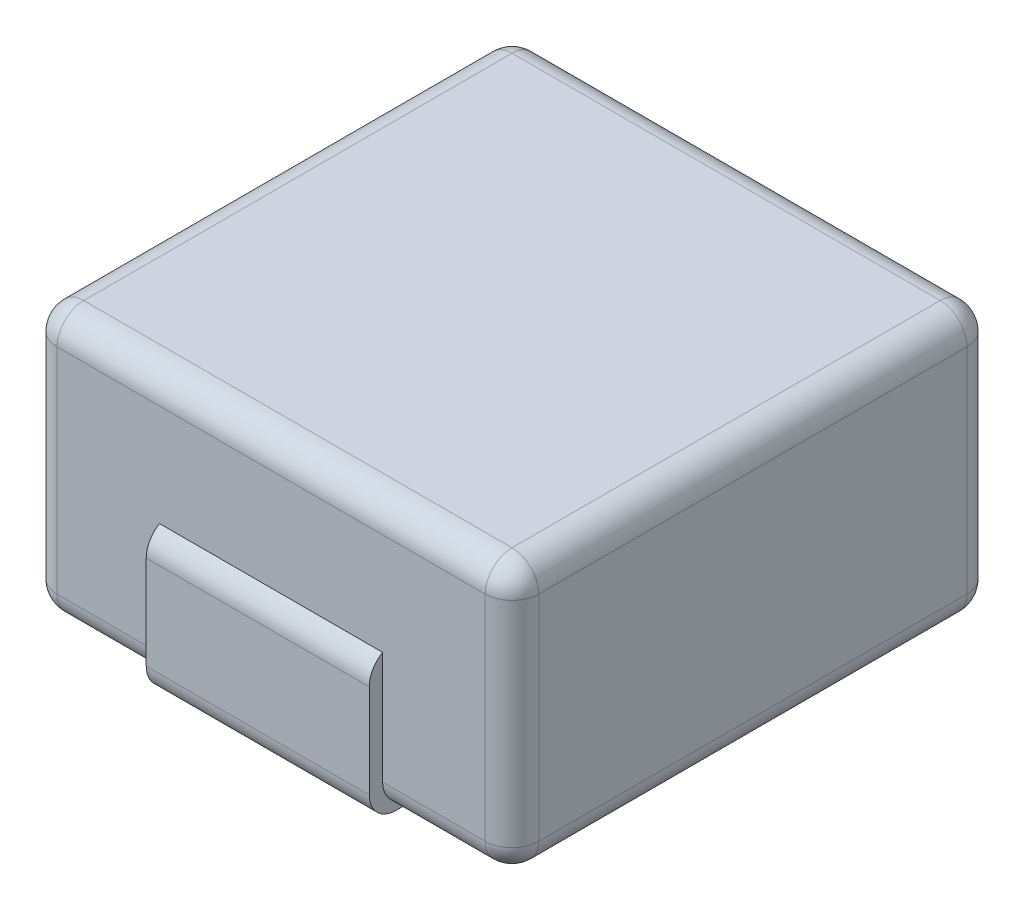
ISO-10303-21;
HEADER;
FILE_DESCRIPTION(('STEP AP214'),'2;1');
FILE_NAME('part.step','',(''),(''),'','','');
FILE_SCHEMA(('AUTOMOTIVE_DESIGN { 1 0 10303 214 1 1 1 1 }'));
ENDSEC;
DATA;
#1=APPLICATION_CONTEXT('core data for automotive mechanical design processes');
#2=APPLICATION_PROTOCOL_DEFINITION('international standard','automotive_design',2000,#1);
#3=PRODUCT_CONTEXT('',#1,'mechanical');
#4=PRODUCT('Part','Part','',(#3));
#5=PRODUCT_RELATED_PRODUCT_CATEGORY('part','',(#4));
#6=PRODUCT_DEFINITION_FORMATION('','',#4);
#7=PRODUCT_DEFINITION_CONTEXT('part definition',#1,'design');
#8=PRODUCT_DEFINITION('design','',#6,#7);
#9=PRODUCT_DEFINITION_SHAPE('','',#8);
#10=(LENGTH_UNIT() NAMED_UNIT(*) SI_UNIT(.MILLI.,.METRE.));
#11=(NAMED_UNIT(*) PLANE_ANGLE_UNIT() SI_UNIT($,.RADIAN.));
#12=(NAMED_UNIT(*) SI_UNIT($,.STERADIAN.) SOLID_ANGLE_UNIT());
#13=UNCERTAINTY_MEASURE_WITH_UNIT(LENGTH_MEASURE(1.E-05),#10,'distance_accuracy_value','');
#14=(GEOMETRIC_REPRESENTATION_CONTEXT(3) GLOBAL_UNCERTAINTY_ASSIGNED_CONTEXT((#13)) GLOBAL_UNIT_ASSIGNED_CONTEXT((#10,
#11,#12)) REPRESENTATION_CONTEXT('',''));
#15=CARTESIAN_POINT('',(0.,0.,0.));
#16=DIRECTION('',(0.,0.,1.));
#17=DIRECTION('',(1.,0.,0.));
#18=AXIS2_PLACEMENT_3D('',#15,#16,#17);
#19=CARTESIAN_POINT('',(-1.25,1.65,-1.45));
#20=DIRECTION('',(-1.,0.,0.));
#21=DIRECTION('',(0.,0.,1.));
#22=AXIS2_PLACEMENT_3D('',#19,#20,#21);
#23=PLANE('',#22);
#24=DIRECTION('',(0.,0.,-1.));
#25=VECTOR('',#24,1.);
#26=CARTESIAN_POINT('',(-1.25,1.65,-1.45));
#27=LINE('',#26,#25);
#28=CARTESIAN_POINT('',(-1.25,1.65,-1.45));
#29=VERTEX_POINT('',#28);
#30=CARTESIAN_POINT('',(-1.25,1.65,-2.55));
#31=VERTEX_POINT('',#30);
#32=EDGE_CURVE('E130',#29,#31,#27,.T.);
#33=ORIENTED_EDGE('',*,*,#32,.T.);
#34=CARTESIAN_POINT('',(-1.25,1.35,-2.55));
#35=DIRECTION('',(-1.,0.,0.));
#36=DIRECTION('',(0.,0.,1.));
#37=AXIS2_PLACEMENT_3D('',#34,#35,#36);
#38=CIRCLE('',#37,0.3);
#39=CARTESIAN_POINT('',(-1.25,1.35,-2.85));
#40=VERTEX_POINT('',#39);
#41=EDGE_CURVE('E60',#31,#40,#38,.T.);
#42=ORIENTED_EDGE('',*,*,#41,.T.);
#43=DIRECTION('',(0.,-1.,0.));
#44=VECTOR('',#43,1.);
#45=CARTESIAN_POINT('',(-1.25,1.65,-2.85));
#46=LINE('',#45,#44);
#47=CARTESIAN_POINT('',(-1.25,0.3,-2.85));
#48=VERTEX_POINT('',#47);
#49=EDGE_CURVE('E138',#40,#48,#46,.T.);
#50=ORIENTED_EDGE('',*,*,#49,.T.);
#51=CARTESIAN_POINT('',(-1.25,0.3,-2.55));
#52=DIRECTION('',(-1.,0.,0.));
#53=DIRECTION('',(0.,0.,1.));
#54=AXIS2_PLACEMENT_3D('',#51,#52,#53);
#55=CIRCLE('',#54,0.3);
#56=CARTESIAN_POINT('',(-1.25,0.,-2.55));
#57=VERTEX_POINT('',#56);
#58=EDGE_CURVE('E67',#48,#57,#55,.T.);
#59=ORIENTED_EDGE('',*,*,#58,.T.);
#60=DIRECTION('',(0.,0.,-1.));
#61=VECTOR('',#60,1.);
#62=CARTESIAN_POINT('',(-1.25,0.,-1.45));
#63=LINE('',#62,#61);
#64=CARTESIAN_POINT('',(-1.25,0.,-1.45));
#65=VERTEX_POINT('',#64);
#66=EDGE_CURVE('E116',#65,#57,#63,.T.);
#67=ORIENTED_EDGE('',*,*,#66,.F.);
#68=DIRECTION('',(0.,-1.,0.));
#69=VECTOR('',#68,1.);
#70=CARTESIAN_POINT('',(-1.25,1.65,-1.45));
#71=LINE('',#70,#69);
#72=EDGE_CURVE('E126',#29,#65,#71,.T.);
#73=ORIENTED_EDGE('',*,*,#72,.F.);
#74=EDGE_LOOP('',(#33,#42,#50,#59,#67,#73));
#75=FACE_BOUND('',#74,.T.);
#76=ADVANCED_FACE('F52',(#75),#23,.T.);
#77=CARTESIAN_POINT('',(-1.25,1.65,-1.45));
#78=DIRECTION('',(0.,0.,1.));
#79=DIRECTION('',(1.,0.,0.));
#80=AXIS2_PLACEMENT_3D('',#77,#78,#79);
#81=PLANE('',#80);
#82=ORIENTED_EDGE('',*,*,#72,.T.);
#83=DIRECTION('',(-1.,0.,0.));
#84=VECTOR('',#83,1.);
#85=CARTESIAN_POINT('',(-1.25,0.,-1.45));
#86=LINE('',#85,#84);
#87=CARTESIAN_POINT('',(1.25,0.,-1.45));
#88=VERTEX_POINT('',#87);
#89=EDGE_CURVE('E113',#88,#65,#86,.T.);
#90=ORIENTED_EDGE('',*,*,#89,.F.);
#91=DIRECTION('',(0.,-1.,0.));
#92=VECTOR('',#91,1.);
#93=CARTESIAN_POINT('',(1.25,1.65,-1.45));
#94=LINE('',#93,#92);
#95=CARTESIAN_POINT('',(1.25,1.65,-1.45));
#96=VERTEX_POINT('',#95);
#97=EDGE_CURVE('E119',#96,#88,#94,.T.);
#98=ORIENTED_EDGE('',*,*,#97,.F.);
#99=DIRECTION('',(-1.,0.,0.));
#100=VECTOR('',#99,1.);
#101=CARTESIAN_POINT('',(-1.25,1.65,-1.45));
#102=LINE('',#101,#100);
#103=EDGE_CURVE('E136',#96,#29,#102,.T.);
#104=ORIENTED_EDGE('',*,*,#103,.T.);
#105=EDGE_LOOP('',(#82,#90,#98,#104));
#106=FACE_BOUND('',#105,.T.);
#107=ADVANCED_FACE('F129',(#106),#81,.T.);
#108=CARTESIAN_POINT('',(1.25,1.65,-1.45));
#109=DIRECTION('',(1.,0.,0.));
#110=DIRECTION('',(0.,0.,-1.));
#111=AXIS2_PLACEMENT_3D('',#108,#109,#110);
#112=PLANE('',#111);
#113=DIRECTION('',(0.,-1.,0.));
#114=VECTOR('',#113,1.);
#115=CARTESIAN_POINT('',(1.25,1.65,-2.85));
#116=LINE('',#115,#114);
#117=CARTESIAN_POINT('',(1.25,1.35,-2.85));
#118=VERTEX_POINT('',#117);
#119=CARTESIAN_POINT('',(1.25,0.3,-2.85));
#120=VERTEX_POINT('',#119);
#121=EDGE_CURVE('E127',#118,#120,#116,.T.);
#122=ORIENTED_EDGE('',*,*,#121,.F.);
#123=CARTESIAN_POINT('',(1.25,1.35,-2.55));
#124=DIRECTION('',(1.,0.,0.));
#125=DIRECTION('',(0.,0.,-1.));
#126=AXIS2_PLACEMENT_3D('',#123,#124,#125);
#127=CIRCLE('',#126,0.3);
#128=CARTESIAN_POINT('',(1.25,1.65,-2.55));
#129=VERTEX_POINT('',#128);
#130=EDGE_CURVE('E150',#118,#129,#127,.T.);
#131=ORIENTED_EDGE('',*,*,#130,.T.);
#132=DIRECTION('',(0.,0.,1.));
#133=VECTOR('',#132,1.);
#134=CARTESIAN_POINT('',(1.25,1.65,-1.45));
#135=LINE('',#134,#133);
#136=EDGE_CURVE('E122',#129,#96,#135,.T.);
#137=ORIENTED_EDGE('',*,*,#136,.T.);
#138=ORIENTED_EDGE('',*,*,#97,.T.);
#139=DIRECTION('',(0.,0.,1.));
#140=VECTOR('',#139,1.);
#141=CARTESIAN_POINT('',(1.25,0.,-1.45));
#142=LINE('',#141,#140);
#143=CARTESIAN_POINT('',(1.25,0.,-2.55));
#144=VERTEX_POINT('',#143);
#145=EDGE_CURVE('E109',#144,#88,#142,.T.);
#146=ORIENTED_EDGE('',*,*,#145,.F.);
#147=CARTESIAN_POINT('',(1.25,0.3,-2.55));
#148=DIRECTION('',(1.,0.,0.));
#149=DIRECTION('',(0.,0.,-1.));
#150=AXIS2_PLACEMENT_3D('',#147,#148,#149);
#151=CIRCLE('',#150,0.3);
#152=EDGE_CURVE('E148',#144,#120,#151,.T.);
#153=ORIENTED_EDGE('',*,*,#152,.T.);
#154=EDGE_LOOP('',(#122,#131,#137,#138,#146,#153));
#155=FACE_BOUND('',#154,.T.);
#156=ADVANCED_FACE('F121',(#155),#112,.T.);
#157=CARTESIAN_POINT('',(-1.25,1.65,-2.85));
#158=DIRECTION('',(0.,0.,-1.));
#159=DIRECTION('',(-1.,0.,0.));
#160=AXIS2_PLACEMENT_3D('',#157,#158,#159);
#161=PLANE('',#160);
#162=ORIENTED_EDGE('',*,*,#49,.F.);
#163=DIRECTION('',(1.,0.,0.));
#164=VECTOR('',#163,1.);
#165=CARTESIAN_POINT('',(1.25,1.35,-2.85));
#166=LINE('',#165,#164);
#167=EDGE_CURVE('E145',#40,#118,#166,.T.);
#168=ORIENTED_EDGE('',*,*,#167,.T.);
#169=ORIENTED_EDGE('',*,*,#121,.T.);
#170=DIRECTION('',(1.,0.,0.));
#171=VECTOR('',#170,1.);
#172=CARTESIAN_POINT('',(-1.25,0.3,-2.85));
#173=LINE('',#172,#171);
#174=EDGE_CURVE('E139',#120,#48,#173,.F.);
#175=ORIENTED_EDGE('',*,*,#174,.T.);
#176=EDGE_LOOP('',(#162,#168,#169,#175));
#177=FACE_BOUND('',#176,.T.);
#178=ADVANCED_FACE('F158',(#177),#161,.T.);
#179=CARTESIAN_POINT('',(0.,1.65,0.));
#180=DIRECTION('',(0.,-1.,0.));
#181=DIRECTION('',(0.,0.,-1.));
#182=AXIS2_PLACEMENT_3D('',#179,#180,#181);
#183=PLANE('',#182);
#184=ORIENTED_EDGE('',*,*,#136,.F.);
#185=DIRECTION('',(1.,0.,0.));
#186=VECTOR('',#185,1.);
#187=CARTESIAN_POINT('',(-1.25,1.65,-2.55));
#188=LINE('',#187,#186);
#189=EDGE_CURVE('E75',#129,#31,#188,.F.);
#190=ORIENTED_EDGE('',*,*,#189,.T.);
#191=ORIENTED_EDGE('',*,*,#32,.F.);
#192=ORIENTED_EDGE('',*,*,#103,.F.);
#193=EDGE_LOOP('',(#184,#190,#191,#192));
#194=FACE_BOUND('',#193,.T.);
#195=ADVANCED_FACE('F161',(#194),#183,.F.);
#196=CARTESIAN_POINT('',(0.,0.,0.));
#197=DIRECTION('',(0.,-1.,0.));
#198=DIRECTION('',(0.,0.,-1.));
#199=AXIS2_PLACEMENT_3D('',#196,#197,#198);
#200=PLANE('',#199);
#201=ORIENTED_EDGE('',*,*,#66,.T.);
#202=DIRECTION('',(1.,0.,0.));
#203=VECTOR('',#202,1.);
#204=CARTESIAN_POINT('',(0.,0.,-2.55));
#205=LINE('',#204,#203);
#206=EDGE_CURVE('E12',#57,#144,#205,.T.);
#207=ORIENTED_EDGE('',*,*,#206,.T.);
#208=ORIENTED_EDGE('',*,*,#145,.T.);
#209=ORIENTED_EDGE('',*,*,#89,.T.);
#210=EDGE_LOOP('',(#201,#207,#208,#209));
#211=FACE_BOUND('',#210,.T.);
#212=ADVANCED_FACE('F111',(#211),#200,.T.);
#213=CARTESIAN_POINT('',(-1.25,1.35,-2.55));
#214=DIRECTION('',(-1.,0.,0.));
#215=DIRECTION('',(0.,0.,1.));
#216=AXIS2_PLACEMENT_3D('',#213,#214,#215);
#217=CYLINDRICAL_SURFACE('',#216,0.3);
#218=ORIENTED_EDGE('',*,*,#41,.F.);
#219=ORIENTED_EDGE('',*,*,#189,.F.);
#220=ORIENTED_EDGE('',*,*,#130,.F.);
#221=ORIENTED_EDGE('',*,*,#167,.F.);
#222=EDGE_LOOP('',(#218,#219,#220,#221));
#223=FACE_BOUND('',#222,.T.);
#224=ADVANCED_FACE('F160',(#223),#217,.T.);
#225=CARTESIAN_POINT('',(0.,0.3,-2.55));
#226=DIRECTION('',(1.,0.,0.));
#227=DIRECTION('',(0.,0.,-1.));
#228=AXIS2_PLACEMENT_3D('',#225,#226,#227);
#229=CYLINDRICAL_SURFACE('',#228,0.3);
#230=ORIENTED_EDGE('',*,*,#58,.F.);
#231=ORIENTED_EDGE('',*,*,#174,.F.);
#232=ORIENTED_EDGE('',*,*,#152,.F.);
#233=ORIENTED_EDGE('',*,*,#206,.F.);
#234=EDGE_LOOP('',(#230,#231,#232,#233));
#235=FACE_BOUND('',#234,.T.);
#236=ADVANCED_FACE('F54',(#235),#229,.T.);
#237=CLOSED_SHELL('',(#76,#107,#156,#178,#195,#212,#224,#236));
#238=MANIFOLD_SOLID_BREP('B2',#237);
#239=CARTESIAN_POINT('',(-1.25,1.65,2.85));
#240=DIRECTION('',(-1.,0.,0.));
#241=DIRECTION('',(0.,0.,1.));
#242=AXIS2_PLACEMENT_3D('',#239,#240,#241);
#243=PLANE('',#242);
#244=DIRECTION('',(0.,-1.,0.));
#245=VECTOR('',#244,1.);
#246=CARTESIAN_POINT('',(-1.25,1.65,2.85));
#247=LINE('',#246,#245);
#248=CARTESIAN_POINT('',(-1.25,1.35,2.85));
#249=VERTEX_POINT('',#248);
#250=CARTESIAN_POINT('',(-1.25,0.3,2.85));
#251=VERTEX_POINT('',#250);
#252=EDGE_CURVE('E321',#249,#251,#247,.T.);
#253=ORIENTED_EDGE('',*,*,#252,.F.);
#254=CARTESIAN_POINT('',(-1.25,1.35,2.55));
#255=DIRECTION('',(-1.,0.,0.));
#256=DIRECTION('',(0.,0.,1.));
#257=AXIS2_PLACEMENT_3D('',#254,#255,#256);
#258=CIRCLE('',#257,0.3);
#259=CARTESIAN_POINT('',(-1.25,1.65,2.55));
#260=VERTEX_POINT('',#259);
#261=EDGE_CURVE('E334',#249,#260,#258,.T.);
#262=ORIENTED_EDGE('',*,*,#261,.T.);
#263=DIRECTION('',(0.,0.,-1.));
#264=VECTOR('',#263,1.);
#265=CARTESIAN_POINT('',(-1.25,1.65,2.85));
#266=LINE('',#265,#264);
#267=CARTESIAN_POINT('',(-1.25,1.65,1.45));
#268=VERTEX_POINT('',#267);
#269=EDGE_CURVE('E305',#260,#268,#266,.T.);
#270=ORIENTED_EDGE('',*,*,#269,.T.);
#271=DIRECTION('',(0.,-1.,0.));
#272=VECTOR('',#271,1.);
#273=CARTESIAN_POINT('',(-1.25,1.65,1.45));
#274=LINE('',#273,#272);
#275=CARTESIAN_POINT('',(-1.25,0.,1.45));
#276=VERTEX_POINT('',#275);
#277=EDGE_CURVE('E303',#268,#276,#274,.T.);
#278=ORIENTED_EDGE('',*,*,#277,.T.);
#279=DIRECTION('',(0.,0.,-1.));
#280=VECTOR('',#279,1.);
#281=CARTESIAN_POINT('',(-1.25,0.,2.85));
#282=LINE('',#281,#280);
#283=CARTESIAN_POINT('',(-1.25,0.,2.55));
#284=VERTEX_POINT('',#283);
#285=EDGE_CURVE('E294',#284,#276,#282,.T.);
#286=ORIENTED_EDGE('',*,*,#285,.F.);
#287=CARTESIAN_POINT('',(-1.25,0.3,2.55));
#288=DIRECTION('',(-1.,0.,0.));
#289=DIRECTION('',(0.,0.,1.));
#290=AXIS2_PLACEMENT_3D('',#287,#288,#289);
#291=CIRCLE('',#290,0.3);
#292=EDGE_CURVE('E332',#284,#251,#291,.T.);
#293=ORIENTED_EDGE('',*,*,#292,.T.);
#294=EDGE_LOOP('',(#253,#262,#270,#278,#286,#293));
#295=FACE_BOUND('',#294,.T.);
#296=ADVANCED_FACE('F237',(#295),#243,.T.);
#297=CARTESIAN_POINT('',(-1.25,1.65,2.85));
#298=DIRECTION('',(0.,0.,1.));
#299=DIRECTION('',(1.,0.,0.));
#300=AXIS2_PLACEMENT_3D('',#297,#298,#299);
#301=PLANE('',#300);
#302=DIRECTION('',(0.,-1.,0.));
#303=VECTOR('',#302,1.);
#304=CARTESIAN_POINT('',(1.25,1.65,2.85));
#305=LINE('',#304,#303);
#306=CARTESIAN_POINT('',(1.25,1.35,2.85));
#307=VERTEX_POINT('',#306);
#308=CARTESIAN_POINT('',(1.25,0.3,2.85));
#309=VERTEX_POINT('',#308);
#310=EDGE_CURVE('E325',#307,#309,#305,.T.);
#311=ORIENTED_EDGE('',*,*,#310,.F.);
#312=DIRECTION('',(-1.,0.,0.));
#313=VECTOR('',#312,1.);
#314=CARTESIAN_POINT('',(-1.25,1.35,2.85));
#315=LINE('',#314,#313);
#316=EDGE_CURVE('E329',#307,#249,#315,.T.);
#317=ORIENTED_EDGE('',*,*,#316,.T.);
#318=ORIENTED_EDGE('',*,*,#252,.T.);
#319=DIRECTION('',(-1.,0.,0.));
#320=VECTOR('',#319,1.);
#321=CARTESIAN_POINT('',(-1.25,0.3,2.85));
#322=LINE('',#321,#320);
#323=EDGE_CURVE('E324',#251,#309,#322,.F.);
#324=ORIENTED_EDGE('',*,*,#323,.T.);
#325=EDGE_LOOP('',(#311,#317,#318,#324));
#326=FACE_BOUND('',#325,.T.);
#327=ADVANCED_FACE('F343',(#326),#301,.T.);
#328=CARTESIAN_POINT('',(1.25,1.65,2.85));
#329=DIRECTION('',(1.,0.,0.));
#330=DIRECTION('',(0.,0.,-1.));
#331=AXIS2_PLACEMENT_3D('',#328,#329,#330);
#332=PLANE('',#331);
#333=DIRECTION('',(0.,0.,1.));
#334=VECTOR('',#333,1.);
#335=CARTESIAN_POINT('',(1.25,1.65,2.85));
#336=LINE('',#335,#334);
#337=CARTESIAN_POINT('',(1.25,1.65,1.45));
#338=VERTEX_POINT('',#337);
#339=CARTESIAN_POINT('',(1.25,1.65,2.55));
#340=VERTEX_POINT('',#339);
#341=EDGE_CURVE('E310',#338,#340,#336,.T.);
#342=ORIENTED_EDGE('',*,*,#341,.T.);
#343=CARTESIAN_POINT('',(1.25,1.35,2.55));
#344=DIRECTION('',(1.,0.,0.));
#345=DIRECTION('',(0.,0.,-1.));
#346=AXIS2_PLACEMENT_3D('',#343,#344,#345);
#347=CIRCLE('',#346,0.3);
#348=EDGE_CURVE('E245',#340,#307,#347,.T.);
#349=ORIENTED_EDGE('',*,*,#348,.T.);
#350=ORIENTED_EDGE('',*,*,#310,.T.);
#351=CARTESIAN_POINT('',(1.25,0.3,2.55));
#352=DIRECTION('',(1.,0.,0.));
#353=DIRECTION('',(0.,0.,-1.));
#354=AXIS2_PLACEMENT_3D('',#351,#352,#353);
#355=CIRCLE('',#354,0.3);
#356=CARTESIAN_POINT('',(1.25,0.,2.55));
#357=VERTEX_POINT('',#356);
#358=EDGE_CURVE('E252',#309,#357,#355,.T.);
#359=ORIENTED_EDGE('',*,*,#358,.T.);
#360=DIRECTION('',(0.,0.,1.));
#361=VECTOR('',#360,1.);
#362=CARTESIAN_POINT('',(1.25,0.,2.85));
#363=LINE('',#362,#361);
#364=CARTESIAN_POINT('',(1.25,0.,1.45));
#365=VERTEX_POINT('',#364);
#366=EDGE_CURVE('E313',#365,#357,#363,.T.);
#367=ORIENTED_EDGE('',*,*,#366,.F.);
#368=DIRECTION('',(0.,-1.,0.));
#369=VECTOR('',#368,1.);
#370=CARTESIAN_POINT('',(1.25,1.65,1.45));
#371=LINE('',#370,#369);
#372=EDGE_CURVE('E309',#338,#365,#371,.T.);
#373=ORIENTED_EDGE('',*,*,#372,.F.);
#374=EDGE_LOOP('',(#342,#349,#350,#359,#367,#373));
#375=FACE_BOUND('',#374,.T.);
#376=ADVANCED_FACE('F339',(#375),#332,.T.);
#377=CARTESIAN_POINT('',(-1.25,1.65,1.45));
#378=DIRECTION('',(0.,0.,-1.));
#379=DIRECTION('',(-1.,0.,0.));
#380=AXIS2_PLACEMENT_3D('',#377,#378,#379);
#381=PLANE('',#380);
#382=ORIENTED_EDGE('',*,*,#372,.T.);
#383=DIRECTION('',(1.,0.,0.));
#384=VECTOR('',#383,1.);
#385=CARTESIAN_POINT('',(-1.25,0.,1.45));
#386=LINE('',#385,#384);
#387=EDGE_CURVE('E298',#276,#365,#386,.T.);
#388=ORIENTED_EDGE('',*,*,#387,.F.);
#389=ORIENTED_EDGE('',*,*,#277,.F.);
#390=DIRECTION('',(1.,0.,0.));
#391=VECTOR('',#390,1.);
#392=CARTESIAN_POINT('',(-1.25,1.65,1.45));
#393=LINE('',#392,#391);
#394=EDGE_CURVE('E318',#268,#338,#393,.T.);
#395=ORIENTED_EDGE('',*,*,#394,.T.);
#396=EDGE_LOOP('',(#382,#388,#389,#395));
#397=FACE_BOUND('',#396,.T.);
#398=ADVANCED_FACE('F312',(#397),#381,.T.);
#399=CARTESIAN_POINT('',(0.,1.65,0.));
#400=DIRECTION('',(0.,-1.,0.));
#401=DIRECTION('',(0.,0.,-1.));
#402=AXIS2_PLACEMENT_3D('',#399,#400,#401);
#403=PLANE('',#402);
#404=ORIENTED_EDGE('',*,*,#269,.F.);
#405=DIRECTION('',(-1.,0.,0.));
#406=VECTOR('',#405,1.);
#407=CARTESIAN_POINT('',(1.25,1.65,2.55));
#408=LINE('',#407,#406);
#409=EDGE_CURVE('E260',#260,#340,#408,.F.);
#410=ORIENTED_EDGE('',*,*,#409,.T.);
#411=ORIENTED_EDGE('',*,*,#341,.F.);
#412=ORIENTED_EDGE('',*,*,#394,.F.);
#413=EDGE_LOOP('',(#404,#410,#411,#412));
#414=FACE_BOUND('',#413,.T.);
#415=ADVANCED_FACE('F346',(#414),#403,.F.);
#416=CARTESIAN_POINT('',(0.,0.,0.));
#417=DIRECTION('',(0.,-1.,0.));
#418=DIRECTION('',(0.,0.,-1.));
#419=AXIS2_PLACEMENT_3D('',#416,#417,#418);
#420=PLANE('',#419);
#421=ORIENTED_EDGE('',*,*,#366,.T.);
#422=DIRECTION('',(-1.,0.,0.));
#423=VECTOR('',#422,1.);
#424=CARTESIAN_POINT('',(0.,0.,2.55));
#425=LINE('',#424,#423);
#426=EDGE_CURVE('E50',#357,#284,#425,.T.);
#427=ORIENTED_EDGE('',*,*,#426,.T.);
#428=ORIENTED_EDGE('',*,*,#285,.T.);
#429=ORIENTED_EDGE('',*,*,#387,.T.);
#430=EDGE_LOOP('',(#421,#427,#428,#429));
#431=FACE_BOUND('',#430,.T.);
#432=ADVANCED_FACE('F296',(#431),#420,.T.);
#433=CARTESIAN_POINT('',(-1.25,1.35,2.55));
#434=DIRECTION('',(1.,0.,0.));
#435=DIRECTION('',(0.,0.,-1.));
#436=AXIS2_PLACEMENT_3D('',#433,#434,#435);
#437=CYLINDRICAL_SURFACE('',#436,0.3);
#438=ORIENTED_EDGE('',*,*,#348,.F.);
#439=ORIENTED_EDGE('',*,*,#409,.F.);
#440=ORIENTED_EDGE('',*,*,#261,.F.);
#441=ORIENTED_EDGE('',*,*,#316,.F.);
#442=EDGE_LOOP('',(#438,#439,#440,#441));
#443=FACE_BOUND('',#442,.T.);
#444=ADVANCED_FACE('F345',(#443),#437,.T.);
#445=CARTESIAN_POINT('',(0.,0.3,2.55));
#446=DIRECTION('',(-1.,0.,0.));
#447=DIRECTION('',(0.,0.,1.));
#448=AXIS2_PLACEMENT_3D('',#445,#446,#447);
#449=CYLINDRICAL_SURFACE('',#448,0.3);
#450=ORIENTED_EDGE('',*,*,#358,.F.);
#451=ORIENTED_EDGE('',*,*,#323,.F.);
#452=ORIENTED_EDGE('',*,*,#292,.F.);
#453=ORIENTED_EDGE('',*,*,#426,.F.);
#454=EDGE_LOOP('',(#450,#451,#452,#453));
#455=FACE_BOUND('',#454,.T.);
#456=ADVANCED_FACE('F239',(#455),#449,.T.);
#457=CLOSED_SHELL('',(#296,#327,#376,#398,#415,#432,#444,#456));
#458=MANIFOLD_SOLID_BREP('B6',#457);
#459=CARTESIAN_POINT('',(2.7,3.05,-2.7));
#460=DIRECTION('',(-1.,0.,0.));
#461=DIRECTION('',(0.,0.,1.));
#462=AXIS2_PLACEMENT_3D('',#459,#460,#461);
#463=PLANE('',#462);
#464=DIRECTION('',(0.,0.,-1.));
#465=VECTOR('',#464,1.);
#466=CARTESIAN_POINT('',(2.7,0.35,-2.7));
#467=LINE('',#466,#465);
#468=CARTESIAN_POINT('',(2.7,0.35,2.4));
#469=VERTEX_POINT('',#468);
#470=CARTESIAN_POINT('',(2.7,0.35,-2.4));
#471=VERTEX_POINT('',#470);
#472=EDGE_CURVE('E587',#469,#471,#467,.T.);
#473=ORIENTED_EDGE('',*,*,#472,.T.);
#474=DIRECTION('',(0.,-1.,0.));
#475=VECTOR('',#474,1.);
#476=CARTESIAN_POINT('',(2.7,3.05,-2.4));
#477=LINE('',#476,#475);
#478=CARTESIAN_POINT('',(2.7,2.75,-2.4));
#479=VERTEX_POINT('',#478);
#480=EDGE_CURVE('E594',#471,#479,#477,.F.);
#481=ORIENTED_EDGE('',*,*,#480,.T.);
#482=DIRECTION('',(0.,0.,-1.));
#483=VECTOR('',#482,1.);
#484=CARTESIAN_POINT('',(2.7,2.75,2.7));
#485=LINE('',#484,#483);
#486=CARTESIAN_POINT('',(2.7,2.75,2.4));
#487=VERTEX_POINT('',#486);
#488=EDGE_CURVE('E590',#479,#487,#485,.F.);
#489=ORIENTED_EDGE('',*,*,#488,.T.);
#490=DIRECTION('',(0.,-1.,0.));
#491=VECTOR('',#490,1.);
#492=CARTESIAN_POINT('',(2.7,3.05,2.4));
#493=LINE('',#492,#491);
#494=EDGE_CURVE('E584',#487,#469,#493,.T.);
#495=ORIENTED_EDGE('',*,*,#494,.T.);
#496=EDGE_LOOP('',(#473,#481,#489,#495));
#497=FACE_BOUND('',#496,.T.);
#498=ADVANCED_FACE('F413',(#497),#463,.F.);
#499=CARTESIAN_POINT('',(-2.7,3.05,-2.7));
#500=DIRECTION('',(0.,0.,1.));
#501=DIRECTION('',(1.,0.,0.));
#502=AXIS2_PLACEMENT_3D('',#499,#500,#501);
#503=PLANE('',#502);
#504=DIRECTION('',(-1.,0.,0.));
#505=VECTOR('',#504,1.);
#506=CARTESIAN_POINT('',(-2.7,0.35,-2.7));
#507=LINE('',#506,#505);
#508=CARTESIAN_POINT('',(2.4,0.35,-2.7));
#509=VERTEX_POINT('',#508);
#510=CARTESIAN_POINT('',(-2.4,0.35,-2.7));
#511=VERTEX_POINT('',#510);
#512=EDGE_CURVE('E574',#509,#511,#507,.T.);
#513=ORIENTED_EDGE('',*,*,#512,.T.);
#514=DIRECTION('',(0.,-1.,0.));
#515=VECTOR('',#514,1.);
#516=CARTESIAN_POINT('',(-2.4,3.05,-2.7));
#517=LINE('',#516,#515);
#518=CARTESIAN_POINT('',(-2.4,2.75,-2.7));
#519=VERTEX_POINT('',#518);
#520=EDGE_CURVE('E581',#511,#519,#517,.F.);
#521=ORIENTED_EDGE('',*,*,#520,.T.);
#522=DIRECTION('',(-1.,0.,0.));
#523=VECTOR('',#522,1.);
#524=CARTESIAN_POINT('',(2.7,2.75,-2.7));
#525=LINE('',#524,#523);
#526=CARTESIAN_POINT('',(2.4,2.75,-2.7));
#527=VERTEX_POINT('',#526);
#528=EDGE_CURVE('E577',#519,#527,#525,.F.);
#529=ORIENTED_EDGE('',*,*,#528,.T.);
#530=DIRECTION('',(0.,-1.,0.));
#531=VECTOR('',#530,1.);
#532=CARTESIAN_POINT('',(2.4,3.05,-2.7));
#533=LINE('',#532,#531);
#534=EDGE_CURVE('E571',#527,#509,#533,.T.);
#535=ORIENTED_EDGE('',*,*,#534,.T.);
#536=EDGE_LOOP('',(#513,#521,#529,#535));
#537=FACE_BOUND('',#536,.T.);
#538=ADVANCED_FACE('F705',(#537),#503,.F.);
#539=CARTESIAN_POINT('',(-2.7,3.05,-2.7));
#540=DIRECTION('',(1.,0.,0.));
#541=DIRECTION('',(0.,0.,-1.));
#542=AXIS2_PLACEMENT_3D('',#539,#540,#541);
#543=PLANE('',#542);
#544=DIRECTION('',(0.,0.,1.));
#545=VECTOR('',#544,1.);
#546=CARTESIAN_POINT('',(-2.7,2.75,-2.7));
#547=LINE('',#546,#545);
#548=CARTESIAN_POINT('',(-2.7,2.75,2.4));
#549=VERTEX_POINT('',#548);
#550=CARTESIAN_POINT('',(-2.7,2.75,-2.4));
#551=VERTEX_POINT('',#550);
#552=EDGE_CURVE('E564',#549,#551,#547,.F.);
#553=ORIENTED_EDGE('',*,*,#552,.T.);
#554=DIRECTION('',(0.,-1.,0.));
#555=VECTOR('',#554,1.);
#556=CARTESIAN_POINT('',(-2.7,3.05,-2.4));
#557=LINE('',#556,#555);
#558=CARTESIAN_POINT('',(-2.7,0.35,-2.4));
#559=VERTEX_POINT('',#558);
#560=EDGE_CURVE('E568',#551,#559,#557,.T.);
#561=ORIENTED_EDGE('',*,*,#560,.T.);
#562=DIRECTION('',(0.,0.,1.));
#563=VECTOR('',#562,1.);
#564=CARTESIAN_POINT('',(-2.7,0.35,-2.7));
#565=LINE('',#564,#563);
#566=CARTESIAN_POINT('',(-2.7,0.35,2.4));
#567=VERTEX_POINT('',#566);
#568=EDGE_CURVE('E561',#559,#567,#565,.T.);
#569=ORIENTED_EDGE('',*,*,#568,.T.);
#570=DIRECTION('',(0.,-1.,0.));
#571=VECTOR('',#570,1.);
#572=CARTESIAN_POINT('',(-2.7,3.05,2.4));
#573=LINE('',#572,#571);
#574=EDGE_CURVE('E558',#567,#549,#573,.F.);
#575=ORIENTED_EDGE('',*,*,#574,.T.);
#576=EDGE_LOOP('',(#553,#561,#569,#575));
#577=FACE_BOUND('',#576,.T.);
#578=ADVANCED_FACE('F696',(#577),#543,.F.);
#579=CARTESIAN_POINT('',(-2.7,3.05,2.7));
#580=DIRECTION('',(0.,0.,-1.));
#581=DIRECTION('',(-1.,0.,0.));
#582=AXIS2_PLACEMENT_3D('',#579,#580,#581);
#583=PLANE('',#582);
#584=DIRECTION('',(1.,0.,0.));
#585=VECTOR('',#584,1.);
#586=CARTESIAN_POINT('',(-2.7,2.75,2.7));
#587=LINE('',#586,#585);
#588=CARTESIAN_POINT('',(2.4,2.75,2.7));
#589=VERTEX_POINT('',#588);
#590=CARTESIAN_POINT('',(-2.4,2.75,2.7));
#591=VERTEX_POINT('',#590);
#592=EDGE_CURVE('E510',#589,#591,#587,.F.);
#593=ORIENTED_EDGE('',*,*,#592,.T.);
#594=DIRECTION('',(0.,-1.,0.));
#595=VECTOR('',#594,1.);
#596=CARTESIAN_POINT('',(-2.4,3.05,2.7));
#597=LINE('',#596,#595);
#598=CARTESIAN_POINT('',(-2.4,0.35,2.7));
#599=VERTEX_POINT('',#598);
#600=EDGE_CURVE('E555',#591,#599,#597,.T.);
#601=ORIENTED_EDGE('',*,*,#600,.T.);
#602=DIRECTION('',(1.,0.,0.));
#603=VECTOR('',#602,1.);
#604=CARTESIAN_POINT('',(-2.7,0.35,2.7));
#605=LINE('',#604,#603);
#606=CARTESIAN_POINT('',(2.4,0.35,2.7));
#607=VERTEX_POINT('',#606);
#608=EDGE_CURVE('E546',#599,#607,#605,.T.);
#609=ORIENTED_EDGE('',*,*,#608,.T.);
#610=DIRECTION('',(0.,-1.,0.));
#611=VECTOR('',#610,1.);
#612=CARTESIAN_POINT('',(2.4,3.05,2.7));
#613=LINE('',#612,#611);
#614=EDGE_CURVE('E542',#607,#589,#613,.F.);
#615=ORIENTED_EDGE('',*,*,#614,.T.);
#616=EDGE_LOOP('',(#593,#601,#609,#615));
#617=FACE_BOUND('',#616,.T.);
#618=ADVANCED_FACE('F738',(#617),#583,.F.);
#619=CARTESIAN_POINT('',(0.,3.05,0.));
#620=DIRECTION('',(0.,1.,0.));
#621=DIRECTION('',(0.,0.,1.));
#622=AXIS2_PLACEMENT_3D('',#619,#620,#621);
#623=PLANE('',#622);
#624=DIRECTION('',(0.,0.,1.));
#625=VECTOR('',#624,1.);
#626=CARTESIAN_POINT('',(-2.4,3.05,2.7));
#627=LINE('',#626,#625);
#628=CARTESIAN_POINT('',(-2.4,3.05,-2.4));
#629=VERTEX_POINT('',#628);
#630=CARTESIAN_POINT('',(-2.4,3.05,2.4));
#631=VERTEX_POINT('',#630);
#632=EDGE_CURVE('E539',#629,#631,#627,.T.);
#633=ORIENTED_EDGE('',*,*,#632,.T.);
#634=DIRECTION('',(1.,0.,0.));
#635=VECTOR('',#634,1.);
#636=CARTESIAN_POINT('',(2.7,3.05,2.4));
#637=LINE('',#636,#635);
#638=CARTESIAN_POINT('',(2.4,3.05,2.4));
#639=VERTEX_POINT('',#638);
#640=EDGE_CURVE('E508',#631,#639,#637,.T.);
#641=ORIENTED_EDGE('',*,*,#640,.T.);
#642=DIRECTION('',(0.,0.,-1.));
#643=VECTOR('',#642,1.);
#644=CARTESIAN_POINT('',(2.4,3.05,-2.7));
#645=LINE('',#644,#643);
#646=CARTESIAN_POINT('',(2.4,3.05,-2.4));
#647=VERTEX_POINT('',#646);
#648=EDGE_CURVE('E528',#639,#647,#645,.T.);
#649=ORIENTED_EDGE('',*,*,#648,.T.);
#650=DIRECTION('',(-1.,0.,0.));
#651=VECTOR('',#650,1.);
#652=CARTESIAN_POINT('',(-2.7,3.05,-2.4));
#653=LINE('',#652,#651);
#654=EDGE_CURVE('E535',#647,#629,#653,.T.);
#655=ORIENTED_EDGE('',*,*,#654,.T.);
#656=EDGE_LOOP('',(#633,#641,#649,#655));
#657=FACE_BOUND('',#656,.T.);
#658=ADVANCED_FACE('F537',(#657),#623,.T.);
#659=CARTESIAN_POINT('',(0.,0.05,0.));
#660=DIRECTION('',(0.,1.,0.));
#661=DIRECTION('',(0.,0.,1.));
#662=AXIS2_PLACEMENT_3D('',#659,#660,#661);
#663=PLANE('',#662);
#664=DIRECTION('',(0.,0.,-1.));
#665=VECTOR('',#664,1.);
#666=CARTESIAN_POINT('',(2.4,0.05,0.));
#667=LINE('',#666,#665);
#668=CARTESIAN_POINT('',(2.4,0.05,-2.4));
#669=VERTEX_POINT('',#668);
#670=CARTESIAN_POINT('',(2.4,0.05,2.4));
#671=VERTEX_POINT('',#670);
#672=EDGE_CURVE('E423',#669,#671,#667,.F.);
#673=ORIENTED_EDGE('',*,*,#672,.T.);
#674=DIRECTION('',(1.,0.,0.));
#675=VECTOR('',#674,1.);
#676=CARTESIAN_POINT('',(0.,0.05,2.4));
#677=LINE('',#676,#675);
#678=CARTESIAN_POINT('',(-2.4,0.05,2.4));
#679=VERTEX_POINT('',#678);
#680=EDGE_CURVE('E235',#671,#679,#677,.F.);
#681=ORIENTED_EDGE('',*,*,#680,.T.);
#682=DIRECTION('',(0.,0.,1.));
#683=VECTOR('',#682,1.);
#684=CARTESIAN_POINT('',(-2.4,0.05,0.));
#685=LINE('',#684,#683);
#686=CARTESIAN_POINT('',(-2.4,0.05,-2.4));
#687=VERTEX_POINT('',#686);
#688=EDGE_CURVE('E597',#679,#687,#685,.F.);
#689=ORIENTED_EDGE('',*,*,#688,.T.);
#690=DIRECTION('',(-1.,0.,0.));
#691=VECTOR('',#690,1.);
#692=CARTESIAN_POINT('',(0.,0.05,-2.4));
#693=LINE('',#692,#691);
#694=EDGE_CURVE('E434',#687,#669,#693,.F.);
#695=ORIENTED_EDGE('',*,*,#694,.T.);
#696=EDGE_LOOP('',(#673,#681,#689,#695));
#697=FACE_BOUND('',#696,.T.);
#698=ADVANCED_FACE('F731',(#697),#663,.F.);
#699=CARTESIAN_POINT('',(-2.7,0.35,-2.4));
#700=DIRECTION('',(-1.,0.,0.));
#701=DIRECTION('',(0.,0.,1.));
#702=AXIS2_PLACEMENT_3D('',#699,#700,#701);
#703=CYLINDRICAL_SURFACE('',#702,0.3);
#704=CARTESIAN_POINT('',(-2.4,0.35,-2.4));
#705=DIRECTION('',(-1.,0.,0.));
#706=DIRECTION('',(0.,0.,1.));
#707=AXIS2_PLACEMENT_3D('',#704,#705,#706);
#708=CIRCLE('',#707,0.3);
#709=EDGE_CURVE('E417',#511,#687,#708,.T.);
#710=ORIENTED_EDGE('',*,*,#709,.F.);
#711=ORIENTED_EDGE('',*,*,#512,.F.);
#712=CARTESIAN_POINT('',(2.4,0.35,-2.4));
#713=DIRECTION('',(1.,0.,0.));
#714=DIRECTION('',(0.,0.,-1.));
#715=AXIS2_PLACEMENT_3D('',#712,#713,#714);
#716=CIRCLE('',#715,0.3);
#717=EDGE_CURVE('E673',#669,#509,#716,.T.);
#718=ORIENTED_EDGE('',*,*,#717,.F.);
#719=ORIENTED_EDGE('',*,*,#694,.F.);
#720=EDGE_LOOP('',(#710,#711,#718,#719));
#721=FACE_BOUND('',#720,.T.);
#722=ADVANCED_FACE('F415',(#721),#703,.T.);
#723=CARTESIAN_POINT('',(-2.4,0.35,-2.4));
#724=DIRECTION('',(0.,0.,1.));
#725=DIRECTION('',(1.,0.,0.));
#726=AXIS2_PLACEMENT_3D('',#723,#724,#725);
#727=SPHERICAL_SURFACE('',#726,0.3);
#728=CARTESIAN_POINT('',(-2.4,0.35,-2.4));
#729=DIRECTION('',(0.,-1.,0.));
#730=DIRECTION('',(0.,0.,-1.));
#731=AXIS2_PLACEMENT_3D('',#728,#729,#730);
#732=CIRCLE('',#731,0.3);
#733=EDGE_CURVE('E666',#511,#559,#732,.F.);
#734=ORIENTED_EDGE('',*,*,#733,.F.);
#735=ORIENTED_EDGE('',*,*,#709,.T.);
#736=CARTESIAN_POINT('',(-2.4,0.35,-2.4));
#737=DIRECTION('',(0.,0.,-1.));
#738=DIRECTION('',(-1.,0.,0.));
#739=AXIS2_PLACEMENT_3D('',#736,#737,#738);
#740=CIRCLE('',#739,0.3);
#741=EDGE_CURVE('E670',#559,#687,#740,.F.);
#742=ORIENTED_EDGE('',*,*,#741,.F.);
#743=EDGE_LOOP('',(#734,#735,#742));
#744=FACE_BOUND('',#743,.T.);
#745=ADVANCED_FACE('F685',(#744),#727,.T.);
#746=CARTESIAN_POINT('',(2.4,0.35,-2.4));
#747=DIRECTION('',(0.,0.,1.));
#748=DIRECTION('',(1.,0.,0.));
#749=AXIS2_PLACEMENT_3D('',#746,#747,#748);
#750=SPHERICAL_SURFACE('',#749,0.3);
#751=CARTESIAN_POINT('',(2.4,0.35,-2.4));
#752=DIRECTION('',(0.,0.,-1.));
#753=DIRECTION('',(-1.,0.,0.));
#754=AXIS2_PLACEMENT_3D('',#751,#752,#753);
#755=CIRCLE('',#754,0.3);
#756=EDGE_CURVE('E658',#669,#471,#755,.F.);
#757=ORIENTED_EDGE('',*,*,#756,.F.);
#758=ORIENTED_EDGE('',*,*,#717,.T.);
#759=CARTESIAN_POINT('',(2.4,0.35,-2.4));
#760=DIRECTION('',(0.,-1.,0.));
#761=DIRECTION('',(0.,0.,-1.));
#762=AXIS2_PLACEMENT_3D('',#759,#760,#761);
#763=CIRCLE('',#762,0.3);
#764=EDGE_CURVE('E662',#471,#509,#763,.F.);
#765=ORIENTED_EDGE('',*,*,#764,.F.);
#766=EDGE_LOOP('',(#757,#758,#765));
#767=FACE_BOUND('',#766,.T.);
#768=ADVANCED_FACE('F717',(#767),#750,.T.);
#769=CARTESIAN_POINT('',(-2.4,0.35,-2.7));
#770=DIRECTION('',(0.,0.,1.));
#771=DIRECTION('',(1.,0.,0.));
#772=AXIS2_PLACEMENT_3D('',#769,#770,#771);
#773=CYLINDRICAL_SURFACE('',#772,0.3);
#774=ORIENTED_EDGE('',*,*,#741,.T.);
#775=ORIENTED_EDGE('',*,*,#688,.F.);
#776=CARTESIAN_POINT('',(-2.4,0.35,2.4));
#777=DIRECTION('',(0.,0.,1.));
#778=DIRECTION('',(1.,0.,0.));
#779=AXIS2_PLACEMENT_3D('',#776,#777,#778);
#780=CIRCLE('',#779,0.3);
#781=EDGE_CURVE('E651',#567,#679,#780,.T.);
#782=ORIENTED_EDGE('',*,*,#781,.F.);
#783=ORIENTED_EDGE('',*,*,#568,.F.);
#784=EDGE_LOOP('',(#774,#775,#782,#783));
#785=FACE_BOUND('',#784,.T.);
#786=ADVANCED_FACE('F692',(#785),#773,.T.);
#787=CARTESIAN_POINT('',(-2.4,3.05,-2.4));
#788=DIRECTION('',(0.,-1.,0.));
#789=DIRECTION('',(0.,0.,-1.));
#790=AXIS2_PLACEMENT_3D('',#787,#788,#789);
#791=CYLINDRICAL_SURFACE('',#790,0.3);
#792=ORIENTED_EDGE('',*,*,#733,.T.);
#793=ORIENTED_EDGE('',*,*,#560,.F.);
#794=CARTESIAN_POINT('',(-2.4,2.75,-2.4));
#795=DIRECTION('',(0.,1.,0.));
#796=DIRECTION('',(0.,0.,1.));
#797=AXIS2_PLACEMENT_3D('',#794,#795,#796);
#798=CIRCLE('',#797,0.3);
#799=EDGE_CURVE('E647',#519,#551,#798,.T.);
#800=ORIENTED_EDGE('',*,*,#799,.F.);
#801=ORIENTED_EDGE('',*,*,#520,.F.);
#802=EDGE_LOOP('',(#792,#793,#800,#801));
#803=FACE_BOUND('',#802,.T.);
#804=ADVANCED_FACE('F702',(#803),#791,.T.);
#805=CARTESIAN_POINT('',(0.,2.75,-2.4));
#806=DIRECTION('',(1.,0.,0.));
#807=DIRECTION('',(0.,0.,-1.));
#808=AXIS2_PLACEMENT_3D('',#805,#806,#807);
#809=CYLINDRICAL_SURFACE('',#808,0.3);
#810=CARTESIAN_POINT('',(2.4,2.75,-2.4));
#811=DIRECTION('',(1.,0.,0.));
#812=DIRECTION('',(0.,0.,-1.));
#813=AXIS2_PLACEMENT_3D('',#810,#811,#812);
#814=CIRCLE('',#813,0.3);
#815=EDGE_CURVE('E639',#527,#647,#814,.T.);
#816=ORIENTED_EDGE('',*,*,#815,.F.);
#817=ORIENTED_EDGE('',*,*,#528,.F.);
#818=CARTESIAN_POINT('',(-2.4,2.75,-2.4));
#819=DIRECTION('',(-1.,0.,0.));
#820=DIRECTION('',(0.,0.,1.));
#821=AXIS2_PLACEMENT_3D('',#818,#819,#820);
#822=CIRCLE('',#821,0.3);
#823=EDGE_CURVE('E643',#629,#519,#822,.T.);
#824=ORIENTED_EDGE('',*,*,#823,.F.);
#825=ORIENTED_EDGE('',*,*,#654,.F.);
#826=EDGE_LOOP('',(#816,#817,#824,#825));
#827=FACE_BOUND('',#826,.T.);
#828=ADVANCED_FACE('F709',(#827),#809,.T.);
#829=CARTESIAN_POINT('',(2.4,3.05,-2.4));
#830=DIRECTION('',(0.,-1.,0.));
#831=DIRECTION('',(0.,0.,-1.));
#832=AXIS2_PLACEMENT_3D('',#829,#830,#831);
#833=CYLINDRICAL_SURFACE('',#832,0.3);
#834=ORIENTED_EDGE('',*,*,#764,.T.);
#835=ORIENTED_EDGE('',*,*,#534,.F.);
#836=CARTESIAN_POINT('',(2.4,2.75,-2.4));
#837=DIRECTION('',(0.,1.,0.));
#838=DIRECTION('',(0.,0.,1.));
#839=AXIS2_PLACEMENT_3D('',#836,#837,#838);
#840=CIRCLE('',#839,0.3);
#841=EDGE_CURVE('E636',#479,#527,#840,.T.);
#842=ORIENTED_EDGE('',*,*,#841,.F.);
#843=ORIENTED_EDGE('',*,*,#480,.F.);
#844=EDGE_LOOP('',(#834,#835,#842,#843));
#845=FACE_BOUND('',#844,.T.);
#846=ADVANCED_FACE('F715',(#845),#833,.T.);
#847=CARTESIAN_POINT('',(2.4,0.35,-2.7));
#848=DIRECTION('',(0.,0.,-1.));
#849=DIRECTION('',(-1.,0.,0.));
#850=AXIS2_PLACEMENT_3D('',#847,#848,#849);
#851=CYLINDRICAL_SURFACE('',#850,0.3);
#852=ORIENTED_EDGE('',*,*,#756,.T.);
#853=ORIENTED_EDGE('',*,*,#472,.F.);
#854=CARTESIAN_POINT('',(2.4,0.35,2.4));
#855=DIRECTION('',(0.,0.,1.));
#856=DIRECTION('',(1.,0.,0.));
#857=AXIS2_PLACEMENT_3D('',#854,#855,#856);
#858=CIRCLE('',#857,0.3);
#859=EDGE_CURVE('E632',#671,#469,#858,.T.);
#860=ORIENTED_EDGE('',*,*,#859,.F.);
#861=ORIENTED_EDGE('',*,*,#672,.F.);
#862=EDGE_LOOP('',(#852,#853,#860,#861));
#863=FACE_BOUND('',#862,.T.);
#864=ADVANCED_FACE('F721',(#863),#851,.T.);
#865=CARTESIAN_POINT('',(-2.7,0.35,2.4));
#866=DIRECTION('',(1.,0.,0.));
#867=DIRECTION('',(0.,0.,-1.));
#868=AXIS2_PLACEMENT_3D('',#865,#866,#867);
#869=CYLINDRICAL_SURFACE('',#868,0.3);
#870=CARTESIAN_POINT('',(-2.4,0.35,2.4));
#871=DIRECTION('',(-1.,0.,0.));
#872=DIRECTION('',(0.,0.,1.));
#873=AXIS2_PLACEMENT_3D('',#870,#871,#872);
#874=CIRCLE('',#873,0.3);
#875=EDGE_CURVE('E654',#679,#599,#874,.T.);
#876=ORIENTED_EDGE('',*,*,#875,.F.);
#877=ORIENTED_EDGE('',*,*,#680,.F.);
#878=CARTESIAN_POINT('',(2.4,0.35,2.4));
#879=DIRECTION('',(1.,0.,0.));
#880=DIRECTION('',(0.,0.,-1.));
#881=AXIS2_PLACEMENT_3D('',#878,#879,#880);
#882=CIRCLE('',#881,0.3);
#883=EDGE_CURVE('E628',#607,#671,#882,.T.);
#884=ORIENTED_EDGE('',*,*,#883,.F.);
#885=ORIENTED_EDGE('',*,*,#608,.F.);
#886=EDGE_LOOP('',(#876,#877,#884,#885));
#887=FACE_BOUND('',#886,.T.);
#888=ADVANCED_FACE('F730',(#887),#869,.T.);
#889=CARTESIAN_POINT('',(-2.4,0.35,2.4));
#890=DIRECTION('',(0.,0.,1.));
#891=DIRECTION('',(1.,0.,0.));
#892=AXIS2_PLACEMENT_3D('',#889,#890,#891);
#893=SPHERICAL_SURFACE('',#892,0.3);
#894=ORIENTED_EDGE('',*,*,#781,.T.);
#895=ORIENTED_EDGE('',*,*,#875,.T.);
#896=CARTESIAN_POINT('',(-2.4,0.35,2.4));
#897=DIRECTION('',(0.,-1.,0.));
#898=DIRECTION('',(0.,0.,-1.));
#899=AXIS2_PLACEMENT_3D('',#896,#897,#898);
#900=CIRCLE('',#899,0.3);
#901=EDGE_CURVE('E624',#567,#599,#900,.F.);
#902=ORIENTED_EDGE('',*,*,#901,.F.);
#903=EDGE_LOOP('',(#894,#895,#902));
#904=FACE_BOUND('',#903,.T.);
#905=ADVANCED_FACE('F780',(#904),#893,.T.);
#906=CARTESIAN_POINT('',(-2.4,2.75,-2.4));
#907=DIRECTION('',(0.,0.,1.));
#908=DIRECTION('',(1.,0.,0.));
#909=AXIS2_PLACEMENT_3D('',#906,#907,#908);
#910=SPHERICAL_SURFACE('',#909,0.3);
#911=ORIENTED_EDGE('',*,*,#823,.T.);
#912=ORIENTED_EDGE('',*,*,#799,.T.);
#913=CARTESIAN_POINT('',(-2.4,2.75,-2.4));
#914=DIRECTION('',(0.,0.,-1.));
#915=DIRECTION('',(-1.,0.,0.));
#916=AXIS2_PLACEMENT_3D('',#913,#914,#915);
#917=CIRCLE('',#916,0.3);
#918=EDGE_CURVE('E621',#629,#551,#917,.F.);
#919=ORIENTED_EDGE('',*,*,#918,.F.);
#920=EDGE_LOOP('',(#911,#912,#919));
#921=FACE_BOUND('',#920,.T.);
#922=ADVANCED_FACE('F777',(#921),#910,.T.);
#923=CARTESIAN_POINT('',(2.4,2.75,-2.4));
#924=DIRECTION('',(0.,0.,1.));
#925=DIRECTION('',(1.,0.,0.));
#926=AXIS2_PLACEMENT_3D('',#923,#924,#925);
#927=SPHERICAL_SURFACE('',#926,0.3);
#928=ORIENTED_EDGE('',*,*,#841,.T.);
#929=ORIENTED_EDGE('',*,*,#815,.T.);
#930=CARTESIAN_POINT('',(2.4,2.75,-2.4));
#931=DIRECTION('',(0.,0.,-1.));
#932=DIRECTION('',(-1.,0.,0.));
#933=AXIS2_PLACEMENT_3D('',#930,#931,#932);
#934=CIRCLE('',#933,0.3);
#935=EDGE_CURVE('E531',#479,#647,#934,.F.);
#936=ORIENTED_EDGE('',*,*,#935,.F.);
#937=EDGE_LOOP('',(#928,#929,#936));
#938=FACE_BOUND('',#937,.T.);
#939=ADVANCED_FACE('F774',(#938),#927,.T.);
#940=CARTESIAN_POINT('',(2.4,0.35,2.4));
#941=DIRECTION('',(0.,0.,1.));
#942=DIRECTION('',(1.,0.,0.));
#943=AXIS2_PLACEMENT_3D('',#940,#941,#942);
#944=SPHERICAL_SURFACE('',#943,0.3);
#945=ORIENTED_EDGE('',*,*,#883,.T.);
#946=ORIENTED_EDGE('',*,*,#859,.T.);
#947=CARTESIAN_POINT('',(2.4,0.35,2.4));
#948=DIRECTION('',(0.,-1.,0.));
#949=DIRECTION('',(0.,0.,-1.));
#950=AXIS2_PLACEMENT_3D('',#947,#948,#949);
#951=CIRCLE('',#950,0.3);
#952=EDGE_CURVE('E615',#607,#469,#951,.F.);
#953=ORIENTED_EDGE('',*,*,#952,.F.);
#954=EDGE_LOOP('',(#945,#946,#953));
#955=FACE_BOUND('',#954,.T.);
#956=ADVANCED_FACE('F725',(#955),#944,.T.);
#957=CARTESIAN_POINT('',(-2.4,3.05,2.4));
#958=DIRECTION('',(0.,-1.,0.));
#959=DIRECTION('',(0.,0.,-1.));
#960=AXIS2_PLACEMENT_3D('',#957,#958,#959);
#961=CYLINDRICAL_SURFACE('',#960,0.3);
#962=ORIENTED_EDGE('',*,*,#901,.T.);
#963=ORIENTED_EDGE('',*,*,#600,.F.);
#964=CARTESIAN_POINT('',(-2.4,2.75,2.4));
#965=DIRECTION('',(0.,1.,0.));
#966=DIRECTION('',(0.,0.,1.));
#967=AXIS2_PLACEMENT_3D('',#964,#965,#966);
#968=CIRCLE('',#967,0.3);
#969=EDGE_CURVE('E611',#549,#591,#968,.T.);
#970=ORIENTED_EDGE('',*,*,#969,.F.);
#971=ORIENTED_EDGE('',*,*,#574,.F.);
#972=EDGE_LOOP('',(#962,#963,#970,#971));
#973=FACE_BOUND('',#972,.T.);
#974=ADVANCED_FACE('F767',(#973),#961,.T.);
#975=CARTESIAN_POINT('',(-2.4,2.75,0.));
#976=DIRECTION('',(0.,0.,-1.));
#977=DIRECTION('',(-1.,0.,0.));
#978=AXIS2_PLACEMENT_3D('',#975,#976,#977);
#979=CYLINDRICAL_SURFACE('',#978,0.3);
#980=ORIENTED_EDGE('',*,*,#918,.T.);
#981=ORIENTED_EDGE('',*,*,#552,.F.);
#982=CARTESIAN_POINT('',(-2.4,2.75,2.4));
#983=DIRECTION('',(0.,0.,1.));
#984=DIRECTION('',(1.,0.,0.));
#985=AXIS2_PLACEMENT_3D('',#982,#983,#984);
#986=CIRCLE('',#985,0.3);
#987=EDGE_CURVE('E525',#631,#549,#986,.T.);
#988=ORIENTED_EDGE('',*,*,#987,.F.);
#989=ORIENTED_EDGE('',*,*,#632,.F.);
#990=EDGE_LOOP('',(#980,#981,#988,#989));
#991=FACE_BOUND('',#990,.T.);
#992=ADVANCED_FACE('F764',(#991),#979,.T.);
#993=CARTESIAN_POINT('',(2.4,2.75,0.));
#994=DIRECTION('',(0.,0.,1.));
#995=DIRECTION('',(1.,0.,0.));
#996=AXIS2_PLACEMENT_3D('',#993,#994,#995);
#997=CYLINDRICAL_SURFACE('',#996,0.3);
#998=ORIENTED_EDGE('',*,*,#935,.T.);
#999=ORIENTED_EDGE('',*,*,#648,.F.);
#1000=CARTESIAN_POINT('',(2.4,2.75,2.4));
#1001=DIRECTION('',(0.,0.,1.));
#1002=DIRECTION('',(1.,0.,0.));
#1003=AXIS2_PLACEMENT_3D('',#1000,#1001,#1002);
#1004=CIRCLE('',#1003,0.3);
#1005=EDGE_CURVE('E516',#487,#639,#1004,.T.);
#1006=ORIENTED_EDGE('',*,*,#1005,.F.);
#1007=ORIENTED_EDGE('',*,*,#488,.F.);
#1008=EDGE_LOOP('',(#998,#999,#1006,#1007));
#1009=FACE_BOUND('',#1008,.T.);
#1010=ADVANCED_FACE('F529',(#1009),#997,.T.);
#1011=CARTESIAN_POINT('',(2.4,3.05,2.4));
#1012=DIRECTION('',(0.,-1.,0.));
#1013=DIRECTION('',(0.,0.,-1.));
#1014=AXIS2_PLACEMENT_3D('',#1011,#1012,#1013);
#1015=CYLINDRICAL_SURFACE('',#1014,0.3);
#1016=ORIENTED_EDGE('',*,*,#952,.T.);
#1017=ORIENTED_EDGE('',*,*,#494,.F.);
#1018=CARTESIAN_POINT('',(2.4,2.75,2.4));
#1019=DIRECTION('',(0.,1.,0.));
#1020=DIRECTION('',(0.,0.,1.));
#1021=AXIS2_PLACEMENT_3D('',#1018,#1019,#1020);
#1022=CIRCLE('',#1021,0.3);
#1023=EDGE_CURVE('E520',#589,#487,#1022,.T.);
#1024=ORIENTED_EDGE('',*,*,#1023,.F.);
#1025=ORIENTED_EDGE('',*,*,#614,.F.);
#1026=EDGE_LOOP('',(#1016,#1017,#1024,#1025));
#1027=FACE_BOUND('',#1026,.T.);
#1028=ADVANCED_FACE('F757',(#1027),#1015,.T.);
#1029=CARTESIAN_POINT('',(-2.4,2.75,2.4));
#1030=DIRECTION('',(0.,0.,1.));
#1031=DIRECTION('',(1.,0.,0.));
#1032=AXIS2_PLACEMENT_3D('',#1029,#1030,#1031);
#1033=SPHERICAL_SURFACE('',#1032,0.3);
#1034=ORIENTED_EDGE('',*,*,#987,.T.);
#1035=ORIENTED_EDGE('',*,*,#969,.T.);
#1036=CARTESIAN_POINT('',(-2.4,2.75,2.4));
#1037=DIRECTION('',(-1.,0.,0.));
#1038=DIRECTION('',(0.,0.,1.));
#1039=AXIS2_PLACEMENT_3D('',#1036,#1037,#1038);
#1040=CIRCLE('',#1039,0.3);
#1041=EDGE_CURVE('E513',#631,#591,#1040,.F.);
#1042=ORIENTED_EDGE('',*,*,#1041,.F.);
#1043=EDGE_LOOP('',(#1034,#1035,#1042));
#1044=FACE_BOUND('',#1043,.T.);
#1045=ADVANCED_FACE('F754',(#1044),#1033,.T.);
#1046=CARTESIAN_POINT('',(2.4,2.75,2.4));
#1047=DIRECTION('',(0.,0.,1.));
#1048=DIRECTION('',(1.,0.,0.));
#1049=AXIS2_PLACEMENT_3D('',#1046,#1047,#1048);
#1050=SPHERICAL_SURFACE('',#1049,0.3);
#1051=ORIENTED_EDGE('',*,*,#1023,.T.);
#1052=ORIENTED_EDGE('',*,*,#1005,.T.);
#1053=CARTESIAN_POINT('',(2.4,2.75,2.4));
#1054=DIRECTION('',(1.,0.,0.));
#1055=DIRECTION('',(0.,0.,-1.));
#1056=AXIS2_PLACEMENT_3D('',#1053,#1054,#1055);
#1057=CIRCLE('',#1056,0.3);
#1058=EDGE_CURVE('E504',#589,#639,#1057,.F.);
#1059=ORIENTED_EDGE('',*,*,#1058,.F.);
#1060=EDGE_LOOP('',(#1051,#1052,#1059));
#1061=FACE_BOUND('',#1060,.T.);
#1062=ADVANCED_FACE('F518',(#1061),#1050,.T.);
#1063=CARTESIAN_POINT('',(0.,2.75,2.4));
#1064=DIRECTION('',(-1.,0.,0.));
#1065=DIRECTION('',(0.,0.,1.));
#1066=AXIS2_PLACEMENT_3D('',#1063,#1064,#1065);
#1067=CYLINDRICAL_SURFACE('',#1066,0.3);
#1068=ORIENTED_EDGE('',*,*,#1041,.T.);
#1069=ORIENTED_EDGE('',*,*,#592,.F.);
#1070=ORIENTED_EDGE('',*,*,#1058,.T.);
#1071=ORIENTED_EDGE('',*,*,#640,.F.);
#1072=EDGE_LOOP('',(#1068,#1069,#1070,#1071));
#1073=FACE_BOUND('',#1072,.T.);
#1074=ADVANCED_FACE('F506',(#1073),#1067,.T.);
#1075=CLOSED_SHELL('',(#498,#538,#578,#618,#658,#698,#722,#745,#768,#786,#804,#828,#846,#864,
#888,#905,#922,#939,#956,#974,#992,#1010,#1028,#1045,#1062,#1074));
#1076=MANIFOLD_SOLID_BREP('B44',#1075);
#1077=ADVANCED_BREP_SHAPE_REPRESENTATION('',(#18,#238,#458,#1076),#14);
#1078=SHAPE_DEFINITION_REPRESENTATION(#9,#1077);
ENDSEC;
END-ISO-10303-21;
